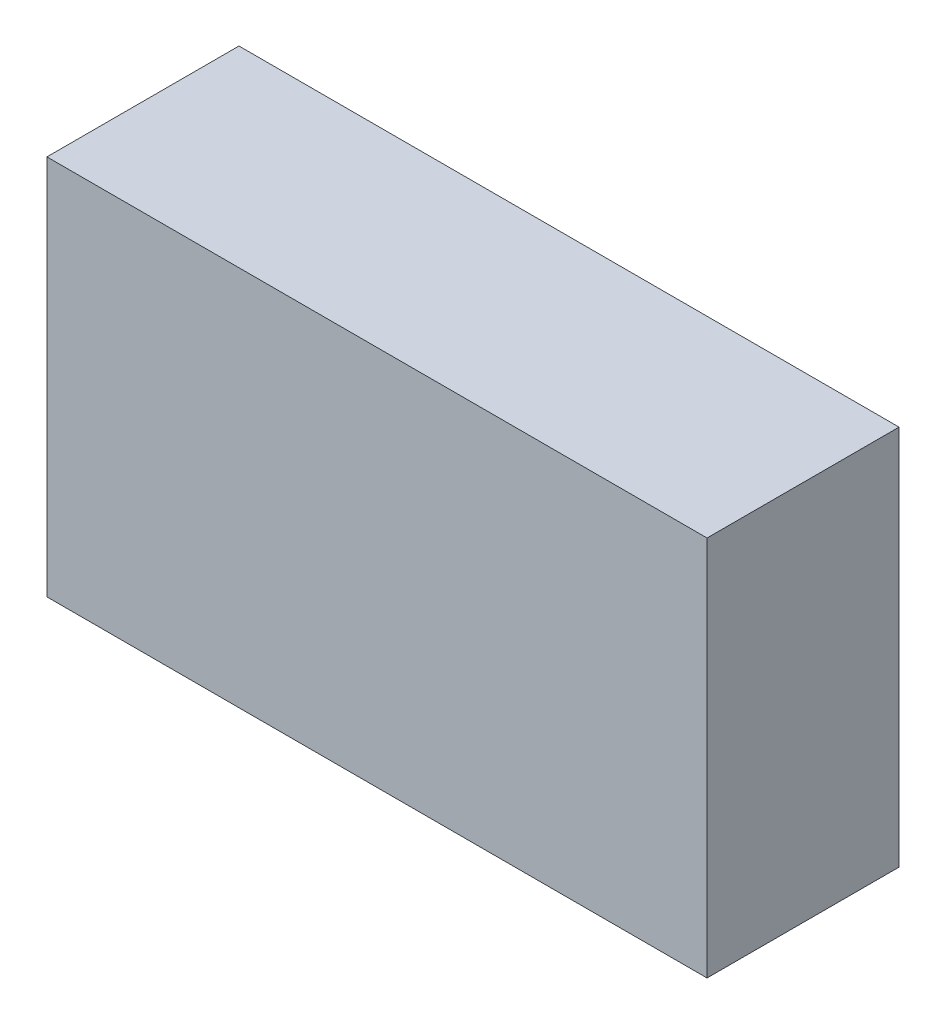
ISO-10303-21;
HEADER;
FILE_DESCRIPTION(('STEP AP214'),'2;1');
FILE_NAME('part.step','',(''),(''),'','','');
FILE_SCHEMA(('AUTOMOTIVE_DESIGN { 1 0 10303 214 1 1 1 1 }'));
ENDSEC;
DATA;
#1=APPLICATION_CONTEXT('core data for automotive mechanical design processes');
#2=APPLICATION_PROTOCOL_DEFINITION('international standard','automotive_design',2000,#1);
#3=PRODUCT_CONTEXT('',#1,'mechanical');
#4=PRODUCT('Part','Part','',(#3));
#5=PRODUCT_RELATED_PRODUCT_CATEGORY('part','',(#4));
#6=PRODUCT_DEFINITION_FORMATION('','',#4);
#7=PRODUCT_DEFINITION_CONTEXT('part definition',#1,'design');
#8=PRODUCT_DEFINITION('design','',#6,#7);
#9=PRODUCT_DEFINITION_SHAPE('','',#8);
#10=(LENGTH_UNIT() NAMED_UNIT(*) SI_UNIT(.MILLI.,.METRE.));
#11=(NAMED_UNIT(*) PLANE_ANGLE_UNIT() SI_UNIT($,.RADIAN.));
#12=(NAMED_UNIT(*) SI_UNIT($,.STERADIAN.) SOLID_ANGLE_UNIT());
#13=UNCERTAINTY_MEASURE_WITH_UNIT(LENGTH_MEASURE(1.E-05),#10,'distance_accuracy_value','');
#14=(GEOMETRIC_REPRESENTATION_CONTEXT(3) GLOBAL_UNCERTAINTY_ASSIGNED_CONTEXT((#13)) GLOBAL_UNIT_ASSIGNED_CONTEXT((#10,
#11,#12)) REPRESENTATION_CONTEXT('',''));
#15=CARTESIAN_POINT('',(0.,0.,0.));
#16=DIRECTION('',(0.,0.,1.));
#17=DIRECTION('',(1.,0.,0.));
#18=AXIS2_PLACEMENT_3D('',#15,#16,#17);
#19=CARTESIAN_POINT('',(55.,31.75,32.));
#20=DIRECTION('',(-1.,0.,0.));
#21=DIRECTION('',(0.,-1.,0.));
#22=AXIS2_PLACEMENT_3D('',#19,#20,#21);
#23=PLANE('',#22);
#24=DIRECTION('',(0.,1.,0.));
#25=VECTOR('',#24,1.);
#26=CARTESIAN_POINT('',(55.,31.75,0.));
#27=LINE('',#26,#25);
#28=CARTESIAN_POINT('',(55.,-31.75,0.));
#29=VERTEX_POINT('',#28);
#30=CARTESIAN_POINT('',(55.,31.75,0.));
#31=VERTEX_POINT('',#30);
#32=EDGE_CURVE('E96',#29,#31,#27,.T.);
#33=ORIENTED_EDGE('',*,*,#32,.T.);
#34=DIRECTION('',(0.,0.,-1.));
#35=VECTOR('',#34,1.);
#36=CARTESIAN_POINT('',(55.,31.75,32.));
#37=LINE('',#36,#35);
#38=CARTESIAN_POINT('',(55.,31.75,32.));
#39=VERTEX_POINT('',#38);
#40=EDGE_CURVE('E11',#39,#31,#37,.T.);
#41=ORIENTED_EDGE('',*,*,#40,.F.);
#42=DIRECTION('',(0.,1.,0.));
#43=VECTOR('',#42,1.);
#44=CARTESIAN_POINT('',(55.,31.75,32.));
#45=LINE('',#44,#43);
#46=CARTESIAN_POINT('',(55.,-31.75,32.));
#47=VERTEX_POINT('',#46);
#48=EDGE_CURVE('E84',#47,#39,#45,.T.);
#49=ORIENTED_EDGE('',*,*,#48,.F.);
#50=DIRECTION('',(0.,0.,-1.));
#51=VECTOR('',#50,1.);
#52=CARTESIAN_POINT('',(55.,-31.75,32.));
#53=LINE('',#52,#51);
#54=EDGE_CURVE('E92',#47,#29,#53,.T.);
#55=ORIENTED_EDGE('',*,*,#54,.T.);
#56=EDGE_LOOP('',(#33,#41,#49,#55));
#57=FACE_BOUND('',#56,.T.);
#58=ADVANCED_FACE('F33',(#57),#23,.F.);
#59=CARTESIAN_POINT('',(-55.,31.75,32.));
#60=DIRECTION('',(0.,-1.,0.));
#61=DIRECTION('',(0.,0.,-1.));
#62=AXIS2_PLACEMENT_3D('',#59,#60,#61);
#63=PLANE('',#62);
#64=DIRECTION('',(-1.,0.,0.));
#65=VECTOR('',#64,1.);
#66=CARTESIAN_POINT('',(-55.,31.75,0.));
#67=LINE('',#66,#65);
#68=CARTESIAN_POINT('',(-55.,31.75,0.));
#69=VERTEX_POINT('',#68);
#70=EDGE_CURVE('E88',#31,#69,#67,.T.);
#71=ORIENTED_EDGE('',*,*,#70,.T.);
#72=DIRECTION('',(0.,0.,-1.));
#73=VECTOR('',#72,1.);
#74=CARTESIAN_POINT('',(-55.,31.75,32.));
#75=LINE('',#74,#73);
#76=CARTESIAN_POINT('',(-55.,31.75,32.));
#77=VERTEX_POINT('',#76);
#78=EDGE_CURVE('E41',#77,#69,#75,.T.);
#79=ORIENTED_EDGE('',*,*,#78,.F.);
#80=DIRECTION('',(-1.,0.,0.));
#81=VECTOR('',#80,1.);
#82=CARTESIAN_POINT('',(-55.,31.75,32.));
#83=LINE('',#82,#81);
#84=EDGE_CURVE('E79',#39,#77,#83,.T.);
#85=ORIENTED_EDGE('',*,*,#84,.F.);
#86=ORIENTED_EDGE('',*,*,#40,.T.);
#87=EDGE_LOOP('',(#71,#79,#85,#86));
#88=FACE_BOUND('',#87,.T.);
#89=ADVANCED_FACE('F87',(#88),#63,.F.);
#90=CARTESIAN_POINT('',(-55.,31.75,32.));
#91=DIRECTION('',(1.,0.,0.));
#92=DIRECTION('',(0.,0.,-1.));
#93=AXIS2_PLACEMENT_3D('',#90,#91,#92);
#94=PLANE('',#93);
#95=DIRECTION('',(0.,-1.,0.));
#96=VECTOR('',#95,1.);
#97=CARTESIAN_POINT('',(-55.,31.75,0.));
#98=LINE('',#97,#96);
#99=CARTESIAN_POINT('',(-55.,-31.75,0.));
#100=VERTEX_POINT('',#99);
#101=EDGE_CURVE('E66',#69,#100,#98,.T.);
#102=ORIENTED_EDGE('',*,*,#101,.T.);
#103=DIRECTION('',(0.,0.,-1.));
#104=VECTOR('',#103,1.);
#105=CARTESIAN_POINT('',(-55.,-31.75,32.));
#106=LINE('',#105,#104);
#107=CARTESIAN_POINT('',(-55.,-31.75,32.));
#108=VERTEX_POINT('',#107);
#109=EDGE_CURVE('E89',#108,#100,#106,.T.);
#110=ORIENTED_EDGE('',*,*,#109,.F.);
#111=DIRECTION('',(0.,-1.,0.));
#112=VECTOR('',#111,1.);
#113=CARTESIAN_POINT('',(-55.,31.75,32.));
#114=LINE('',#113,#112);
#115=EDGE_CURVE('E82',#77,#108,#114,.T.);
#116=ORIENTED_EDGE('',*,*,#115,.F.);
#117=ORIENTED_EDGE('',*,*,#78,.T.);
#118=EDGE_LOOP('',(#102,#110,#116,#117));
#119=FACE_BOUND('',#118,.T.);
#120=ADVANCED_FACE('F90',(#119),#94,.F.);
#121=CARTESIAN_POINT('',(-55.,-31.75,32.));
#122=DIRECTION('',(0.,1.,0.));
#123=DIRECTION('',(0.,0.,1.));
#124=AXIS2_PLACEMENT_3D('',#121,#122,#123);
#125=PLANE('',#124);
#126=DIRECTION('',(1.,0.,0.));
#127=VECTOR('',#126,1.);
#128=CARTESIAN_POINT('',(-55.,-31.75,0.));
#129=LINE('',#128,#127);
#130=EDGE_CURVE('E72',#100,#29,#129,.T.);
#131=ORIENTED_EDGE('',*,*,#130,.T.);
#132=ORIENTED_EDGE('',*,*,#54,.F.);
#133=DIRECTION('',(1.,0.,0.));
#134=VECTOR('',#133,1.);
#135=CARTESIAN_POINT('',(-55.,-31.75,32.));
#136=LINE('',#135,#134);
#137=EDGE_CURVE('E49',#108,#47,#136,.T.);
#138=ORIENTED_EDGE('',*,*,#137,.F.);
#139=ORIENTED_EDGE('',*,*,#109,.T.);
#140=EDGE_LOOP('',(#131,#132,#138,#139));
#141=FACE_BOUND('',#140,.T.);
#142=ADVANCED_FACE('F103',(#141),#125,.F.);
#143=CARTESIAN_POINT('',(0.,0.,32.));
#144=DIRECTION('',(0.,0.,1.));
#145=DIRECTION('',(1.,0.,0.));
#146=AXIS2_PLACEMENT_3D('',#143,#144,#145);
#147=PLANE('',#146);
#148=ORIENTED_EDGE('',*,*,#48,.T.);
#149=ORIENTED_EDGE('',*,*,#84,.T.);
#150=ORIENTED_EDGE('',*,*,#115,.T.);
#151=ORIENTED_EDGE('',*,*,#137,.T.);
#152=EDGE_LOOP('',(#148,#149,#150,#151));
#153=FACE_BOUND('',#152,.T.);
#154=ADVANCED_FACE('F80',(#153),#147,.T.);
#155=CARTESIAN_POINT('',(0.,0.,0.));
#156=DIRECTION('',(0.,0.,1.));
#157=DIRECTION('',(1.,0.,0.));
#158=AXIS2_PLACEMENT_3D('',#155,#156,#157);
#159=PLANE('',#158);
#160=ORIENTED_EDGE('',*,*,#32,.F.);
#161=ORIENTED_EDGE('',*,*,#130,.F.);
#162=ORIENTED_EDGE('',*,*,#101,.F.);
#163=ORIENTED_EDGE('',*,*,#70,.F.);
#164=EDGE_LOOP('',(#160,#161,#162,#163));
#165=FACE_BOUND('',#164,.T.);
#166=ADVANCED_FACE('F106',(#165),#159,.F.);
#167=CLOSED_SHELL('',(#58,#89,#120,#142,#154,#166));
#168=MANIFOLD_SOLID_BREP('B2',#167);
#169=ADVANCED_BREP_SHAPE_REPRESENTATION('',(#18,#168),#14);
#170=SHAPE_DEFINITION_REPRESENTATION(#9,#169);
ENDSEC;
END-ISO-10303-21;
